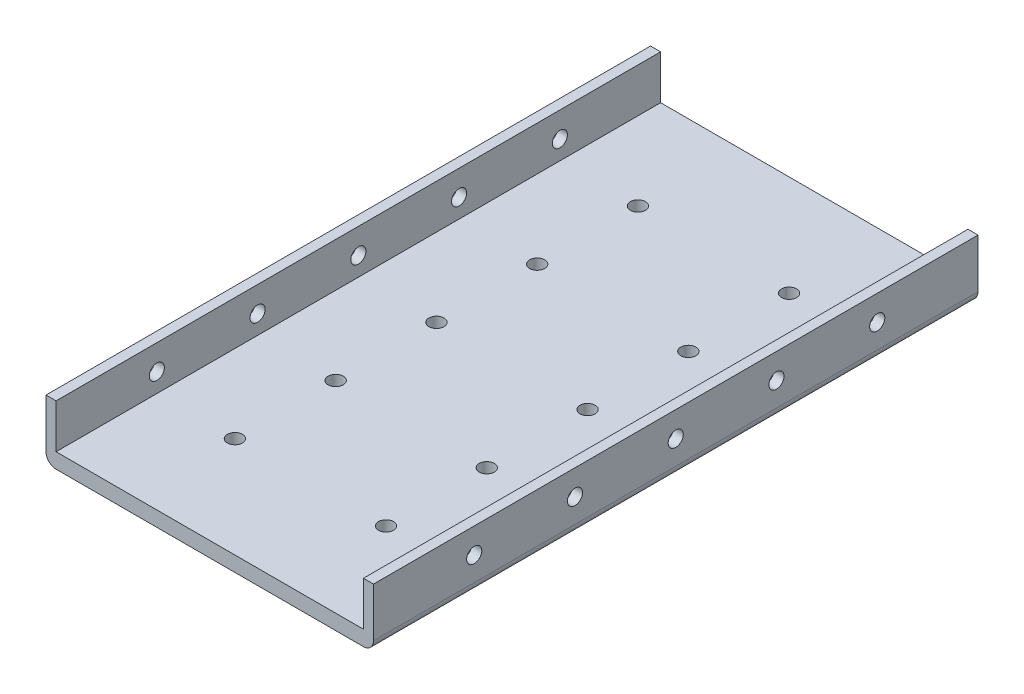
ISO-10303-21;
HEADER;
FILE_DESCRIPTION(('STEP AP214'),'2;1');
FILE_NAME('part.step','',(''),(''),'','','');
FILE_SCHEMA(('AUTOMOTIVE_DESIGN { 1 0 10303 214 1 1 1 1 }'));
ENDSEC;
DATA;
#1=APPLICATION_CONTEXT('core data for automotive mechanical design processes');
#2=APPLICATION_PROTOCOL_DEFINITION('international standard','automotive_design',2000,#1);
#3=PRODUCT_CONTEXT('',#1,'mechanical');
#4=PRODUCT('Part','Part','',(#3));
#5=PRODUCT_RELATED_PRODUCT_CATEGORY('part','',(#4));
#6=PRODUCT_DEFINITION_FORMATION('','',#4);
#7=PRODUCT_DEFINITION_CONTEXT('part definition',#1,'design');
#8=PRODUCT_DEFINITION('design','',#6,#7);
#9=PRODUCT_DEFINITION_SHAPE('','',#8);
#10=(LENGTH_UNIT() NAMED_UNIT(*) SI_UNIT(.MILLI.,.METRE.));
#11=(NAMED_UNIT(*) PLANE_ANGLE_UNIT() SI_UNIT($,.RADIAN.));
#12=(NAMED_UNIT(*) SI_UNIT($,.STERADIAN.) SOLID_ANGLE_UNIT());
#13=UNCERTAINTY_MEASURE_WITH_UNIT(LENGTH_MEASURE(1.E-05),#10,'distance_accuracy_value','');
#14=(GEOMETRIC_REPRESENTATION_CONTEXT(3) GLOBAL_UNCERTAINTY_ASSIGNED_CONTEXT((#13)) GLOBAL_UNIT_ASSIGNED_CONTEXT((#10,
#11,#12)) REPRESENTATION_CONTEXT('',''));
#15=CARTESIAN_POINT('',(0.,0.,0.));
#16=DIRECTION('',(0.,0.,1.));
#17=DIRECTION('',(1.,0.,0.));
#18=AXIS2_PLACEMENT_3D('',#15,#16,#17);
#19=CARTESIAN_POINT('',(0.,3.,0.));
#20=DIRECTION('',(0.,-1.,0.));
#21=DIRECTION('',(0.,0.,-1.));
#22=AXIS2_PLACEMENT_3D('',#19,#20,#21);
#23=PLANE('',#22);
#24=CARTESIAN_POINT('',(15.,3.,0.));
#25=DIRECTION('',(0.,-1.,0.));
#26=DIRECTION('',(0.,0.,-1.));
#27=AXIS2_PLACEMENT_3D('',#24,#25,#26);
#28=CIRCLE('',#27,1.5);
#29=CARTESIAN_POINT('',(15.,3.,-1.50000000000001));
#30=VERTEX_POINT('',#29);
#31=EDGE_CURVE('E286',#30,#30,#28,.T.);
#32=ORIENTED_EDGE('',*,*,#31,.T.);
#33=EDGE_LOOP('',(#32));
#34=FACE_BOUND('',#33,.T.);
#35=CARTESIAN_POINT('',(-15.,3.,-20.));
#36=DIRECTION('',(0.,-1.,0.));
#37=DIRECTION('',(0.,0.,-1.));
#38=AXIS2_PLACEMENT_3D('',#35,#36,#37);
#39=CIRCLE('',#38,1.5);
#40=CARTESIAN_POINT('',(-15.,3.,-21.5));
#41=VERTEX_POINT('',#40);
#42=EDGE_CURVE('E283',#41,#41,#39,.T.);
#43=ORIENTED_EDGE('',*,*,#42,.T.);
#44=EDGE_LOOP('',(#43));
#45=FACE_BOUND('',#44,.T.);
#46=CARTESIAN_POINT('',(15.,3.,-20.));
#47=DIRECTION('',(0.,-1.,0.));
#48=DIRECTION('',(0.,0.,-1.));
#49=AXIS2_PLACEMENT_3D('',#46,#47,#48);
#50=CIRCLE('',#49,1.49999999999999);
#51=CARTESIAN_POINT('',(15.,3.,-21.5));
#52=VERTEX_POINT('',#51);
#53=EDGE_CURVE('E280',#52,#52,#50,.T.);
#54=ORIENTED_EDGE('',*,*,#53,.T.);
#55=EDGE_LOOP('',(#54));
#56=FACE_BOUND('',#55,.T.);
#57=CARTESIAN_POINT('',(-15.,3.,-40.));
#58=DIRECTION('',(0.,-1.,0.));
#59=DIRECTION('',(0.,0.,-1.));
#60=AXIS2_PLACEMENT_3D('',#57,#58,#59);
#61=CIRCLE('',#60,1.5);
#62=CARTESIAN_POINT('',(-15.,3.,-41.5));
#63=VERTEX_POINT('',#62);
#64=EDGE_CURVE('E277',#63,#63,#61,.T.);
#65=ORIENTED_EDGE('',*,*,#64,.T.);
#66=EDGE_LOOP('',(#65));
#67=FACE_BOUND('',#66,.T.);
#68=CARTESIAN_POINT('',(15.,3.,40.));
#69=DIRECTION('',(0.,-1.,0.));
#70=DIRECTION('',(0.,0.,-1.));
#71=AXIS2_PLACEMENT_3D('',#68,#69,#70);
#72=CIRCLE('',#71,1.5);
#73=CARTESIAN_POINT('',(15.,3.,38.5));
#74=VERTEX_POINT('',#73);
#75=EDGE_CURVE('E274',#74,#74,#72,.T.);
#76=ORIENTED_EDGE('',*,*,#75,.T.);
#77=EDGE_LOOP('',(#76));
#78=FACE_BOUND('',#77,.T.);
#79=CARTESIAN_POINT('',(-15.,3.,20.));
#80=DIRECTION('',(0.,-1.,0.));
#81=DIRECTION('',(0.,0.,-1.));
#82=AXIS2_PLACEMENT_3D('',#79,#80,#81);
#83=CIRCLE('',#82,1.5);
#84=CARTESIAN_POINT('',(-15.,3.,18.5));
#85=VERTEX_POINT('',#84);
#86=EDGE_CURVE('E271',#85,#85,#83,.T.);
#87=ORIENTED_EDGE('',*,*,#86,.T.);
#88=EDGE_LOOP('',(#87));
#89=FACE_BOUND('',#88,.T.);
#90=CARTESIAN_POINT('',(15.,3.,20.));
#91=DIRECTION('',(0.,-1.,0.));
#92=DIRECTION('',(0.,0.,-1.));
#93=AXIS2_PLACEMENT_3D('',#90,#91,#92);
#94=CIRCLE('',#93,1.49999999999999);
#95=CARTESIAN_POINT('',(15.,3.,18.5));
#96=VERTEX_POINT('',#95);
#97=EDGE_CURVE('E268',#96,#96,#94,.T.);
#98=ORIENTED_EDGE('',*,*,#97,.T.);
#99=EDGE_LOOP('',(#98));
#100=FACE_BOUND('',#99,.T.);
#101=CARTESIAN_POINT('',(-15.,3.,0.));
#102=DIRECTION('',(0.,-1.,0.));
#103=DIRECTION('',(0.,0.,-1.));
#104=AXIS2_PLACEMENT_3D('',#101,#102,#103);
#105=CIRCLE('',#104,1.5);
#106=CARTESIAN_POINT('',(-15.,3.,-1.50000000000002));
#107=VERTEX_POINT('',#106);
#108=EDGE_CURVE('E265',#107,#107,#105,.T.);
#109=ORIENTED_EDGE('',*,*,#108,.T.);
#110=EDGE_LOOP('',(#109));
#111=FACE_BOUND('',#110,.T.);
#112=CARTESIAN_POINT('',(15.,3.,-40.));
#113=DIRECTION('',(0.,-1.,0.));
#114=DIRECTION('',(0.,0.,-1.));
#115=AXIS2_PLACEMENT_3D('',#112,#113,#114);
#116=CIRCLE('',#115,1.5);
#117=CARTESIAN_POINT('',(15.,3.,-41.5));
#118=VERTEX_POINT('',#117);
#119=EDGE_CURVE('E262',#118,#118,#116,.T.);
#120=ORIENTED_EDGE('',*,*,#119,.T.);
#121=EDGE_LOOP('',(#120));
#122=FACE_BOUND('',#121,.T.);
#123=CARTESIAN_POINT('',(-15.,3.,40.));
#124=DIRECTION('',(0.,-1.,0.));
#125=DIRECTION('',(0.,0.,-1.));
#126=AXIS2_PLACEMENT_3D('',#123,#124,#125);
#127=CIRCLE('',#126,1.5);
#128=CARTESIAN_POINT('',(-15.,3.,38.5));
#129=VERTEX_POINT('',#128);
#130=EDGE_CURVE('E259',#129,#129,#127,.T.);
#131=ORIENTED_EDGE('',*,*,#130,.T.);
#132=EDGE_LOOP('',(#131));
#133=FACE_BOUND('',#132,.T.);
#134=DIRECTION('',(0.,0.,1.));
#135=VECTOR('',#134,1.);
#136=CARTESIAN_POINT('',(30.5,3.,-60.));
#137=LINE('',#136,#135);
#138=CARTESIAN_POINT('',(30.5,3.,-60.));
#139=VERTEX_POINT('',#138);
#140=CARTESIAN_POINT('',(30.5,3.,60.));
#141=VERTEX_POINT('',#140);
#142=EDGE_CURVE('E148',#139,#141,#137,.T.);
#143=ORIENTED_EDGE('',*,*,#142,.F.);
#144=DIRECTION('',(-1.,0.,0.));
#145=VECTOR('',#144,1.);
#146=CARTESIAN_POINT('',(-32.5,3.,-60.));
#147=LINE('',#146,#145);
#148=CARTESIAN_POINT('',(-30.5,3.,-60.));
#149=VERTEX_POINT('',#148);
#150=EDGE_CURVE('E176',#139,#149,#147,.T.);
#151=ORIENTED_EDGE('',*,*,#150,.T.);
#152=DIRECTION('',(0.,0.,-1.));
#153=VECTOR('',#152,1.);
#154=CARTESIAN_POINT('',(-30.5,3.,-60.));
#155=LINE('',#154,#153);
#156=CARTESIAN_POINT('',(-30.5,3.,60.));
#157=VERTEX_POINT('',#156);
#158=EDGE_CURVE('E152',#157,#149,#155,.T.);
#159=ORIENTED_EDGE('',*,*,#158,.F.);
#160=DIRECTION('',(1.,0.,0.));
#161=VECTOR('',#160,1.);
#162=CARTESIAN_POINT('',(-32.5,3.,60.));
#163=LINE('',#162,#161);
#164=EDGE_CURVE('E133',#157,#141,#163,.T.);
#165=ORIENTED_EDGE('',*,*,#164,.T.);
#166=EDGE_LOOP('',(#143,#151,#159,#165));
#167=FACE_BOUND('',#166,.T.);
#168=ADVANCED_FACE('F41',(#34,#45,#56,#67,#78,#89,#100,#111,#122,#133,#167),#23,.F.);
#169=CARTESIAN_POINT('',(32.5,3.,60.));
#170=DIRECTION('',(-1.,0.,0.));
#171=DIRECTION('',(0.,0.,1.));
#172=AXIS2_PLACEMENT_3D('',#169,#170,#171);
#173=PLANE('',#172);
#174=CARTESIAN_POINT('',(32.5,6.75,-40.));
#175=DIRECTION('',(-1.,0.,0.));
#176=DIRECTION('',(0.,0.,1.));
#177=AXIS2_PLACEMENT_3D('',#174,#175,#176);
#178=CIRCLE('',#177,1.5);
#179=CARTESIAN_POINT('',(32.5,6.75,-38.5));
#180=VERTEX_POINT('',#179);
#181=EDGE_CURVE('E204',#180,#180,#178,.T.);
#182=ORIENTED_EDGE('',*,*,#181,.T.);
#183=EDGE_LOOP('',(#182));
#184=FACE_BOUND('',#183,.T.);
#185=CARTESIAN_POINT('',(32.5,6.75,-20.));
#186=DIRECTION('',(-1.,0.,0.));
#187=DIRECTION('',(0.,0.,1.));
#188=AXIS2_PLACEMENT_3D('',#185,#186,#187);
#189=CIRCLE('',#188,1.5);
#190=CARTESIAN_POINT('',(32.5,6.75,-18.5));
#191=VERTEX_POINT('',#190);
#192=EDGE_CURVE('E672',#191,#191,#189,.T.);
#193=ORIENTED_EDGE('',*,*,#192,.T.);
#194=EDGE_LOOP('',(#193));
#195=FACE_BOUND('',#194,.T.);
#196=CARTESIAN_POINT('',(32.5,6.75,0.));
#197=DIRECTION('',(-1.,0.,0.));
#198=DIRECTION('',(0.,0.,1.));
#199=AXIS2_PLACEMENT_3D('',#196,#197,#198);
#200=CIRCLE('',#199,1.5);
#201=CARTESIAN_POINT('',(32.5,6.75,1.5));
#202=VERTEX_POINT('',#201);
#203=EDGE_CURVE('E666',#202,#202,#200,.T.);
#204=ORIENTED_EDGE('',*,*,#203,.T.);
#205=EDGE_LOOP('',(#204));
#206=FACE_BOUND('',#205,.T.);
#207=CARTESIAN_POINT('',(32.5,6.75,20.));
#208=DIRECTION('',(-1.,0.,0.));
#209=DIRECTION('',(0.,0.,1.));
#210=AXIS2_PLACEMENT_3D('',#207,#208,#209);
#211=CIRCLE('',#210,1.5);
#212=CARTESIAN_POINT('',(32.5,6.75,21.5));
#213=VERTEX_POINT('',#212);
#214=EDGE_CURVE('E660',#213,#213,#211,.T.);
#215=ORIENTED_EDGE('',*,*,#214,.T.);
#216=EDGE_LOOP('',(#215));
#217=FACE_BOUND('',#216,.T.);
#218=CARTESIAN_POINT('',(32.5,6.75,40.));
#219=DIRECTION('',(-1.,0.,0.));
#220=DIRECTION('',(0.,0.,1.));
#221=AXIS2_PLACEMENT_3D('',#218,#219,#220);
#222=CIRCLE('',#221,1.5);
#223=CARTESIAN_POINT('',(32.5,6.75,41.5));
#224=VERTEX_POINT('',#223);
#225=EDGE_CURVE('E654',#224,#224,#222,.T.);
#226=ORIENTED_EDGE('',*,*,#225,.T.);
#227=EDGE_LOOP('',(#226));
#228=FACE_BOUND('',#227,.T.);
#229=DIRECTION('',(0.,-1.,0.));
#230=VECTOR('',#229,1.);
#231=CARTESIAN_POINT('',(32.5,3.,60.));
#232=LINE('',#231,#230);
#233=CARTESIAN_POINT('',(32.5,11.75,60.));
#234=VERTEX_POINT('',#233);
#235=CARTESIAN_POINT('',(32.5,2.,60.));
#236=VERTEX_POINT('',#235);
#237=EDGE_CURVE('E122',#234,#236,#232,.T.);
#238=ORIENTED_EDGE('',*,*,#237,.T.);
#239=DIRECTION('',(0.,0.,-1.));
#240=VECTOR('',#239,1.);
#241=CARTESIAN_POINT('',(32.5,2.,-60.));
#242=LINE('',#241,#240);
#243=CARTESIAN_POINT('',(32.5,2.,-60.));
#244=VERTEX_POINT('',#243);
#245=EDGE_CURVE('E189',#236,#244,#242,.T.);
#246=ORIENTED_EDGE('',*,*,#245,.T.);
#247=DIRECTION('',(0.,-1.,0.));
#248=VECTOR('',#247,1.);
#249=CARTESIAN_POINT('',(32.5,3.,-60.));
#250=LINE('',#249,#248);
#251=CARTESIAN_POINT('',(32.5,11.75,-60.));
#252=VERTEX_POINT('',#251);
#253=EDGE_CURVE('E146',#252,#244,#250,.T.);
#254=ORIENTED_EDGE('',*,*,#253,.F.);
#255=DIRECTION('',(0.,0.,-1.));
#256=VECTOR('',#255,1.);
#257=CARTESIAN_POINT('',(32.5,11.75,-60.));
#258=LINE('',#257,#256);
#259=EDGE_CURVE('E138',#234,#252,#258,.T.);
#260=ORIENTED_EDGE('',*,*,#259,.F.);
#261=EDGE_LOOP('',(#238,#246,#254,#260));
#262=FACE_BOUND('',#261,.T.);
#263=ADVANCED_FACE('F144',(#184,#195,#206,#217,#228,#262),#173,.F.);
#264=CARTESIAN_POINT('',(-32.5,3.,-60.));
#265=DIRECTION('',(0.,0.,1.));
#266=DIRECTION('',(1.,0.,0.));
#267=AXIS2_PLACEMENT_3D('',#264,#265,#266);
#268=PLANE('',#267);
#269=ORIENTED_EDGE('',*,*,#253,.T.);
#270=CARTESIAN_POINT('',(30.5,2.,-60.));
#271=DIRECTION('',(0.,0.,1.));
#272=DIRECTION('',(1.,0.,0.));
#273=AXIS2_PLACEMENT_3D('',#270,#271,#272);
#274=CIRCLE('',#273,2.);
#275=CARTESIAN_POINT('',(30.5,0.,-60.));
#276=VERTEX_POINT('',#275);
#277=EDGE_CURVE('E193',#244,#276,#274,.F.);
#278=ORIENTED_EDGE('',*,*,#277,.T.);
#279=DIRECTION('',(-1.,0.,0.));
#280=VECTOR('',#279,1.);
#281=CARTESIAN_POINT('',(-32.5,0.,-60.));
#282=LINE('',#281,#280);
#283=CARTESIAN_POINT('',(-30.5,0.,-60.));
#284=VERTEX_POINT('',#283);
#285=EDGE_CURVE('E175',#276,#284,#282,.T.);
#286=ORIENTED_EDGE('',*,*,#285,.T.);
#287=CARTESIAN_POINT('',(-30.5,2.,-60.));
#288=DIRECTION('',(0.,0.,1.));
#289=DIRECTION('',(1.,0.,0.));
#290=AXIS2_PLACEMENT_3D('',#287,#288,#289);
#291=CIRCLE('',#290,2.);
#292=CARTESIAN_POINT('',(-32.5,2.,-60.));
#293=VERTEX_POINT('',#292);
#294=EDGE_CURVE('E191',#284,#293,#291,.F.);
#295=ORIENTED_EDGE('',*,*,#294,.T.);
#296=DIRECTION('',(0.,-1.,0.));
#297=VECTOR('',#296,1.);
#298=CARTESIAN_POINT('',(-32.5,3.,-60.));
#299=LINE('',#298,#297);
#300=CARTESIAN_POINT('',(-32.5,11.75,-60.));
#301=VERTEX_POINT('',#300);
#302=EDGE_CURVE('E185',#301,#293,#299,.T.);
#303=ORIENTED_EDGE('',*,*,#302,.F.);
#304=DIRECTION('',(-1.,0.,0.));
#305=VECTOR('',#304,1.);
#306=CARTESIAN_POINT('',(-32.5,11.75,-60.));
#307=LINE('',#306,#305);
#308=CARTESIAN_POINT('',(-30.5,11.75,-60.));
#309=VERTEX_POINT('',#308);
#310=EDGE_CURVE('E164',#309,#301,#307,.T.);
#311=ORIENTED_EDGE('',*,*,#310,.F.);
#312=DIRECTION('',(0.,-1.,0.));
#313=VECTOR('',#312,1.);
#314=CARTESIAN_POINT('',(-30.5,11.75,-60.));
#315=LINE('',#314,#313);
#316=EDGE_CURVE('E167',#309,#149,#315,.T.);
#317=ORIENTED_EDGE('',*,*,#316,.T.);
#318=ORIENTED_EDGE('',*,*,#150,.F.);
#319=DIRECTION('',(0.,-1.,0.));
#320=VECTOR('',#319,1.);
#321=CARTESIAN_POINT('',(30.5,11.75,-60.));
#322=LINE('',#321,#320);
#323=CARTESIAN_POINT('',(30.5,11.75,-60.));
#324=VERTEX_POINT('',#323);
#325=EDGE_CURVE('E289',#324,#139,#322,.T.);
#326=ORIENTED_EDGE('',*,*,#325,.F.);
#327=DIRECTION('',(-1.,0.,0.));
#328=VECTOR('',#327,1.);
#329=CARTESIAN_POINT('',(32.5,11.75,-60.));
#330=LINE('',#329,#328);
#331=EDGE_CURVE('E149',#252,#324,#330,.T.);
#332=ORIENTED_EDGE('',*,*,#331,.F.);
#333=EDGE_LOOP('',(#269,#278,#286,#295,#303,#311,#317,#318,#326,#332));
#334=FACE_BOUND('',#333,.T.);
#335=ADVANCED_FACE('F300',(#334),#268,.F.);
#336=CARTESIAN_POINT('',(-32.5,3.,60.));
#337=DIRECTION('',(1.,0.,0.));
#338=DIRECTION('',(0.,0.,-1.));
#339=AXIS2_PLACEMENT_3D('',#336,#337,#338);
#340=PLANE('',#339);
#341=CARTESIAN_POINT('',(-32.5,6.75,-40.));
#342=DIRECTION('',(-1.,0.,0.));
#343=DIRECTION('',(0.,0.,1.));
#344=AXIS2_PLACEMENT_3D('',#341,#342,#343);
#345=CIRCLE('',#344,1.5);
#346=CARTESIAN_POINT('',(-32.5,6.75,-38.5));
#347=VERTEX_POINT('',#346);
#348=EDGE_CURVE('E642',#347,#347,#345,.T.);
#349=ORIENTED_EDGE('',*,*,#348,.F.);
#350=EDGE_LOOP('',(#349));
#351=FACE_BOUND('',#350,.T.);
#352=CARTESIAN_POINT('',(-32.5,6.75,-20.));
#353=DIRECTION('',(-1.,0.,0.));
#354=DIRECTION('',(0.,0.,1.));
#355=AXIS2_PLACEMENT_3D('',#352,#353,#354);
#356=CIRCLE('',#355,1.5);
#357=CARTESIAN_POINT('',(-32.5,6.75,-18.5));
#358=VERTEX_POINT('',#357);
#359=EDGE_CURVE('E675',#358,#358,#356,.T.);
#360=ORIENTED_EDGE('',*,*,#359,.F.);
#361=EDGE_LOOP('',(#360));
#362=FACE_BOUND('',#361,.T.);
#363=CARTESIAN_POINT('',(-32.5,6.75,0.));
#364=DIRECTION('',(-1.,0.,0.));
#365=DIRECTION('',(0.,0.,1.));
#366=AXIS2_PLACEMENT_3D('',#363,#364,#365);
#367=CIRCLE('',#366,1.5);
#368=CARTESIAN_POINT('',(-32.5,6.75,1.5));
#369=VERTEX_POINT('',#368);
#370=EDGE_CURVE('E669',#369,#369,#367,.T.);
#371=ORIENTED_EDGE('',*,*,#370,.F.);
#372=EDGE_LOOP('',(#371));
#373=FACE_BOUND('',#372,.T.);
#374=CARTESIAN_POINT('',(-32.5,6.75,20.));
#375=DIRECTION('',(-1.,0.,0.));
#376=DIRECTION('',(0.,0.,1.));
#377=AXIS2_PLACEMENT_3D('',#374,#375,#376);
#378=CIRCLE('',#377,1.5);
#379=CARTESIAN_POINT('',(-32.5,6.75,21.5));
#380=VERTEX_POINT('',#379);
#381=EDGE_CURVE('E663',#380,#380,#378,.T.);
#382=ORIENTED_EDGE('',*,*,#381,.F.);
#383=EDGE_LOOP('',(#382));
#384=FACE_BOUND('',#383,.T.);
#385=CARTESIAN_POINT('',(-32.5,6.75,40.));
#386=DIRECTION('',(-1.,0.,0.));
#387=DIRECTION('',(0.,0.,1.));
#388=AXIS2_PLACEMENT_3D('',#385,#386,#387);
#389=CIRCLE('',#388,1.5);
#390=CARTESIAN_POINT('',(-32.5,6.75,41.5));
#391=VERTEX_POINT('',#390);
#392=EDGE_CURVE('E657',#391,#391,#389,.T.);
#393=ORIENTED_EDGE('',*,*,#392,.F.);
#394=EDGE_LOOP('',(#393));
#395=FACE_BOUND('',#394,.T.);
#396=ORIENTED_EDGE('',*,*,#302,.T.);
#397=DIRECTION('',(0.,0.,1.));
#398=VECTOR('',#397,1.);
#399=CARTESIAN_POINT('',(-32.5,2.,60.));
#400=LINE('',#399,#398);
#401=CARTESIAN_POINT('',(-32.5,2.,60.));
#402=VERTEX_POINT('',#401);
#403=EDGE_CURVE('E11',#293,#402,#400,.T.);
#404=ORIENTED_EDGE('',*,*,#403,.T.);
#405=DIRECTION('',(0.,-1.,0.));
#406=VECTOR('',#405,1.);
#407=CARTESIAN_POINT('',(-32.5,3.,60.));
#408=LINE('',#407,#406);
#409=CARTESIAN_POINT('',(-32.5,11.75,60.));
#410=VERTEX_POINT('',#409);
#411=EDGE_CURVE('E132',#410,#402,#408,.T.);
#412=ORIENTED_EDGE('',*,*,#411,.F.);
#413=DIRECTION('',(0.,0.,1.));
#414=VECTOR('',#413,1.);
#415=CARTESIAN_POINT('',(-32.5,11.75,-60.));
#416=LINE('',#415,#414);
#417=EDGE_CURVE('E157',#301,#410,#416,.T.);
#418=ORIENTED_EDGE('',*,*,#417,.F.);
#419=EDGE_LOOP('',(#396,#404,#412,#418));
#420=FACE_BOUND('',#419,.T.);
#421=ADVANCED_FACE('F311',(#351,#362,#373,#384,#395,#420),#340,.F.);
#422=CARTESIAN_POINT('',(-32.5,3.,60.));
#423=DIRECTION('',(0.,0.,-1.));
#424=DIRECTION('',(-1.,0.,0.));
#425=AXIS2_PLACEMENT_3D('',#422,#423,#424);
#426=PLANE('',#425);
#427=DIRECTION('',(1.,0.,0.));
#428=VECTOR('',#427,1.);
#429=CARTESIAN_POINT('',(-32.5,0.,60.));
#430=LINE('',#429,#428);
#431=CARTESIAN_POINT('',(-30.5,0.,60.));
#432=VERTEX_POINT('',#431);
#433=CARTESIAN_POINT('',(30.5,0.,60.));
#434=VERTEX_POINT('',#433);
#435=EDGE_CURVE('E178',#432,#434,#430,.T.);
#436=ORIENTED_EDGE('',*,*,#435,.T.);
#437=CARTESIAN_POINT('',(30.5,2.,60.));
#438=DIRECTION('',(0.,0.,-1.));
#439=DIRECTION('',(-1.,0.,0.));
#440=AXIS2_PLACEMENT_3D('',#437,#438,#439);
#441=CIRCLE('',#440,2.);
#442=EDGE_CURVE('E50',#434,#236,#441,.F.);
#443=ORIENTED_EDGE('',*,*,#442,.T.);
#444=ORIENTED_EDGE('',*,*,#237,.F.);
#445=DIRECTION('',(1.,0.,0.));
#446=VECTOR('',#445,1.);
#447=CARTESIAN_POINT('',(32.5,11.75,60.));
#448=LINE('',#447,#446);
#449=CARTESIAN_POINT('',(30.5,11.75,60.));
#450=VERTEX_POINT('',#449);
#451=EDGE_CURVE('E126',#450,#234,#448,.T.);
#452=ORIENTED_EDGE('',*,*,#451,.F.);
#453=DIRECTION('',(0.,-1.,0.));
#454=VECTOR('',#453,1.);
#455=CARTESIAN_POINT('',(30.5,11.75,60.));
#456=LINE('',#455,#454);
#457=EDGE_CURVE('E142',#450,#141,#456,.T.);
#458=ORIENTED_EDGE('',*,*,#457,.T.);
#459=ORIENTED_EDGE('',*,*,#164,.F.);
#460=DIRECTION('',(0.,-1.,0.));
#461=VECTOR('',#460,1.);
#462=CARTESIAN_POINT('',(-30.5,11.75,60.));
#463=LINE('',#462,#461);
#464=CARTESIAN_POINT('',(-30.5,11.75,60.));
#465=VERTEX_POINT('',#464);
#466=EDGE_CURVE('E172',#465,#157,#463,.T.);
#467=ORIENTED_EDGE('',*,*,#466,.F.);
#468=DIRECTION('',(1.,0.,0.));
#469=VECTOR('',#468,1.);
#470=CARTESIAN_POINT('',(-32.5,11.75,60.));
#471=LINE('',#470,#469);
#472=EDGE_CURVE('E160',#410,#465,#471,.T.);
#473=ORIENTED_EDGE('',*,*,#472,.F.);
#474=ORIENTED_EDGE('',*,*,#411,.T.);
#475=CARTESIAN_POINT('',(-30.5,2.,60.));
#476=DIRECTION('',(0.,0.,-1.));
#477=DIRECTION('',(-1.,0.,0.));
#478=AXIS2_PLACEMENT_3D('',#475,#476,#477);
#479=CIRCLE('',#478,2.);
#480=EDGE_CURVE('E58',#402,#432,#479,.F.);
#481=ORIENTED_EDGE('',*,*,#480,.T.);
#482=EDGE_LOOP('',(#436,#443,#444,#452,#458,#459,#467,#473,#474,#481));
#483=FACE_BOUND('',#482,.T.);
#484=ADVANCED_FACE('F124',(#483),#426,.F.);
#485=CARTESIAN_POINT('',(0.,0.,0.));
#486=DIRECTION('',(0.,-1.,0.));
#487=DIRECTION('',(0.,0.,-1.));
#488=AXIS2_PLACEMENT_3D('',#485,#486,#487);
#489=PLANE('',#488);
#490=CARTESIAN_POINT('',(15.,0.,0.));
#491=DIRECTION('',(0.,-1.,0.));
#492=DIRECTION('',(0.,0.,1.));
#493=AXIS2_PLACEMENT_3D('',#490,#491,#492);
#494=CIRCLE('',#493,1.5);
#495=CARTESIAN_POINT('',(15.,0.,1.49999999999998));
#496=VERTEX_POINT('',#495);
#497=EDGE_CURVE('E239',#496,#496,#494,.T.);
#498=ORIENTED_EDGE('',*,*,#497,.F.);
#499=EDGE_LOOP('',(#498));
#500=FACE_BOUND('',#499,.T.);
#501=CARTESIAN_POINT('',(-15.,0.,-20.));
#502=DIRECTION('',(0.,-1.,0.));
#503=DIRECTION('',(0.,0.,-1.));
#504=AXIS2_PLACEMENT_3D('',#501,#502,#503);
#505=CIRCLE('',#504,1.5);
#506=CARTESIAN_POINT('',(-15.,0.,-21.5));
#507=VERTEX_POINT('',#506);
#508=EDGE_CURVE('E236',#507,#507,#505,.T.);
#509=ORIENTED_EDGE('',*,*,#508,.F.);
#510=EDGE_LOOP('',(#509));
#511=FACE_BOUND('',#510,.T.);
#512=CARTESIAN_POINT('',(15.,0.,-20.));
#513=DIRECTION('',(0.,-1.,0.));
#514=DIRECTION('',(0.,0.,1.));
#515=AXIS2_PLACEMENT_3D('',#512,#513,#514);
#516=CIRCLE('',#515,1.49999999999999);
#517=CARTESIAN_POINT('',(15.,0.,-18.5));
#518=VERTEX_POINT('',#517);
#519=EDGE_CURVE('E233',#518,#518,#516,.T.);
#520=ORIENTED_EDGE('',*,*,#519,.F.);
#521=EDGE_LOOP('',(#520));
#522=FACE_BOUND('',#521,.T.);
#523=CARTESIAN_POINT('',(-15.,0.,-40.));
#524=DIRECTION('',(0.,-1.,0.));
#525=DIRECTION('',(0.,0.,-1.));
#526=AXIS2_PLACEMENT_3D('',#523,#524,#525);
#527=CIRCLE('',#526,1.5);
#528=CARTESIAN_POINT('',(-15.,0.,-41.5));
#529=VERTEX_POINT('',#528);
#530=EDGE_CURVE('E232',#529,#529,#527,.T.);
#531=ORIENTED_EDGE('',*,*,#530,.F.);
#532=EDGE_LOOP('',(#531));
#533=FACE_BOUND('',#532,.T.);
#534=CARTESIAN_POINT('',(15.,0.,40.));
#535=DIRECTION('',(0.,-1.,0.));
#536=DIRECTION('',(0.,0.,1.));
#537=AXIS2_PLACEMENT_3D('',#534,#535,#536);
#538=CIRCLE('',#537,1.5);
#539=CARTESIAN_POINT('',(15.,0.,41.5));
#540=VERTEX_POINT('',#539);
#541=EDGE_CURVE('E251',#540,#540,#538,.T.);
#542=ORIENTED_EDGE('',*,*,#541,.F.);
#543=EDGE_LOOP('',(#542));
#544=FACE_BOUND('',#543,.T.);
#545=CARTESIAN_POINT('',(-15.,0.,20.));
#546=DIRECTION('',(0.,-1.,0.));
#547=DIRECTION('',(0.,0.,-1.));
#548=AXIS2_PLACEMENT_3D('',#545,#546,#547);
#549=CIRCLE('',#548,1.5);
#550=CARTESIAN_POINT('',(-15.,0.,18.5));
#551=VERTEX_POINT('',#550);
#552=EDGE_CURVE('E248',#551,#551,#549,.T.);
#553=ORIENTED_EDGE('',*,*,#552,.F.);
#554=EDGE_LOOP('',(#553));
#555=FACE_BOUND('',#554,.T.);
#556=CARTESIAN_POINT('',(15.,0.,20.));
#557=DIRECTION('',(0.,-1.,0.));
#558=DIRECTION('',(0.,0.,1.));
#559=AXIS2_PLACEMENT_3D('',#556,#557,#558);
#560=CIRCLE('',#559,1.49999999999999);
#561=CARTESIAN_POINT('',(15.,0.,21.5));
#562=VERTEX_POINT('',#561);
#563=EDGE_CURVE('E245',#562,#562,#560,.T.);
#564=ORIENTED_EDGE('',*,*,#563,.F.);
#565=EDGE_LOOP('',(#564));
#566=FACE_BOUND('',#565,.T.);
#567=CARTESIAN_POINT('',(-15.,0.,0.));
#568=DIRECTION('',(0.,-1.,0.));
#569=DIRECTION('',(0.,0.,-1.));
#570=AXIS2_PLACEMENT_3D('',#567,#568,#569);
#571=CIRCLE('',#570,1.5);
#572=CARTESIAN_POINT('',(-15.,0.,-1.50000000000002));
#573=VERTEX_POINT('',#572);
#574=EDGE_CURVE('E242',#573,#573,#571,.T.);
#575=ORIENTED_EDGE('',*,*,#574,.F.);
#576=EDGE_LOOP('',(#575));
#577=FACE_BOUND('',#576,.T.);
#578=CARTESIAN_POINT('',(15.,0.,-40.));
#579=DIRECTION('',(0.,-1.,0.));
#580=DIRECTION('',(0.,0.,1.));
#581=AXIS2_PLACEMENT_3D('',#578,#579,#580);
#582=CIRCLE('',#581,1.5);
#583=CARTESIAN_POINT('',(15.,0.,-38.5));
#584=VERTEX_POINT('',#583);
#585=EDGE_CURVE('E229',#584,#584,#582,.T.);
#586=ORIENTED_EDGE('',*,*,#585,.F.);
#587=EDGE_LOOP('',(#586));
#588=FACE_BOUND('',#587,.T.);
#589=CARTESIAN_POINT('',(-15.,0.,40.));
#590=DIRECTION('',(0.,-1.,0.));
#591=DIRECTION('',(0.,0.,-1.));
#592=AXIS2_PLACEMENT_3D('',#589,#590,#591);
#593=CIRCLE('',#592,1.5);
#594=CARTESIAN_POINT('',(-15.,0.,38.5));
#595=VERTEX_POINT('',#594);
#596=EDGE_CURVE('E254',#595,#595,#593,.T.);
#597=ORIENTED_EDGE('',*,*,#596,.F.);
#598=EDGE_LOOP('',(#597));
#599=FACE_BOUND('',#598,.T.);
#600=ORIENTED_EDGE('',*,*,#285,.F.);
#601=DIRECTION('',(0.,0.,-1.));
#602=VECTOR('',#601,1.);
#603=CARTESIAN_POINT('',(30.5,0.,60.));
#604=LINE('',#603,#602);
#605=EDGE_CURVE('E65',#276,#434,#604,.F.);
#606=ORIENTED_EDGE('',*,*,#605,.T.);
#607=ORIENTED_EDGE('',*,*,#435,.F.);
#608=DIRECTION('',(0.,0.,1.));
#609=VECTOR('',#608,1.);
#610=CARTESIAN_POINT('',(-30.5,0.,-60.));
#611=LINE('',#610,#609);
#612=EDGE_CURVE('E195',#432,#284,#611,.F.);
#613=ORIENTED_EDGE('',*,*,#612,.T.);
#614=EDGE_LOOP('',(#600,#606,#607,#613));
#615=FACE_BOUND('',#614,.T.);
#616=ADVANCED_FACE('F313',(#500,#511,#522,#533,#544,#555,#566,#577,#588,#599,#615),#489,.T.);
#617=CARTESIAN_POINT('',(-30.5,11.75,-60.));
#618=DIRECTION('',(-1.,0.,0.));
#619=DIRECTION('',(0.,0.,1.));
#620=AXIS2_PLACEMENT_3D('',#617,#618,#619);
#621=PLANE('',#620);
#622=CARTESIAN_POINT('',(-30.5,6.75,-40.));
#623=DIRECTION('',(-1.,0.,0.));
#624=DIRECTION('',(0.,0.,1.));
#625=AXIS2_PLACEMENT_3D('',#622,#623,#624);
#626=CIRCLE('',#625,1.5);
#627=CARTESIAN_POINT('',(-30.5,6.75,-38.5));
#628=VERTEX_POINT('',#627);
#629=EDGE_CURVE('E226',#628,#628,#626,.T.);
#630=ORIENTED_EDGE('',*,*,#629,.T.);
#631=EDGE_LOOP('',(#630));
#632=FACE_BOUND('',#631,.T.);
#633=CARTESIAN_POINT('',(-30.5,6.75,-20.));
#634=DIRECTION('',(-1.,0.,0.));
#635=DIRECTION('',(0.,0.,1.));
#636=AXIS2_PLACEMENT_3D('',#633,#634,#635);
#637=CIRCLE('',#636,1.5);
#638=CARTESIAN_POINT('',(-30.5,6.75,-18.5));
#639=VERTEX_POINT('',#638);
#640=EDGE_CURVE('E214',#639,#639,#637,.T.);
#641=ORIENTED_EDGE('',*,*,#640,.T.);
#642=EDGE_LOOP('',(#641));
#643=FACE_BOUND('',#642,.T.);
#644=CARTESIAN_POINT('',(-30.5,6.75,0.));
#645=DIRECTION('',(-1.,0.,0.));
#646=DIRECTION('',(0.,0.,1.));
#647=AXIS2_PLACEMENT_3D('',#644,#645,#646);
#648=CIRCLE('',#647,1.5);
#649=CARTESIAN_POINT('',(-30.5,6.75,1.5));
#650=VERTEX_POINT('',#649);
#651=EDGE_CURVE('E211',#650,#650,#648,.T.);
#652=ORIENTED_EDGE('',*,*,#651,.T.);
#653=EDGE_LOOP('',(#652));
#654=FACE_BOUND('',#653,.T.);
#655=CARTESIAN_POINT('',(-30.5,6.75,20.));
#656=DIRECTION('',(-1.,0.,0.));
#657=DIRECTION('',(0.,0.,1.));
#658=AXIS2_PLACEMENT_3D('',#655,#656,#657);
#659=CIRCLE('',#658,1.5);
#660=CARTESIAN_POINT('',(-30.5,6.75,21.5));
#661=VERTEX_POINT('',#660);
#662=EDGE_CURVE('E208',#661,#661,#659,.T.);
#663=ORIENTED_EDGE('',*,*,#662,.T.);
#664=EDGE_LOOP('',(#663));
#665=FACE_BOUND('',#664,.T.);
#666=CARTESIAN_POINT('',(-30.5,6.75,40.));
#667=DIRECTION('',(-1.,0.,0.));
#668=DIRECTION('',(0.,0.,1.));
#669=AXIS2_PLACEMENT_3D('',#666,#667,#668);
#670=CIRCLE('',#669,1.5);
#671=CARTESIAN_POINT('',(-30.5,6.75,41.5));
#672=VERTEX_POINT('',#671);
#673=EDGE_CURVE('E203',#672,#672,#670,.T.);
#674=ORIENTED_EDGE('',*,*,#673,.T.);
#675=EDGE_LOOP('',(#674));
#676=FACE_BOUND('',#675,.T.);
#677=ORIENTED_EDGE('',*,*,#158,.T.);
#678=ORIENTED_EDGE('',*,*,#316,.F.);
#679=DIRECTION('',(0.,0.,-1.));
#680=VECTOR('',#679,1.);
#681=CARTESIAN_POINT('',(-30.5,11.75,-60.));
#682=LINE('',#681,#680);
#683=EDGE_CURVE('E162',#465,#309,#682,.T.);
#684=ORIENTED_EDGE('',*,*,#683,.F.);
#685=ORIENTED_EDGE('',*,*,#466,.T.);
#686=EDGE_LOOP('',(#677,#678,#684,#685));
#687=FACE_BOUND('',#686,.T.);
#688=ADVANCED_FACE('F305',(#632,#643,#654,#665,#676,#687),#621,.F.);
#689=CARTESIAN_POINT('',(0.,11.75,0.));
#690=DIRECTION('',(0.,1.,0.));
#691=DIRECTION('',(0.,0.,1.));
#692=AXIS2_PLACEMENT_3D('',#689,#690,#691);
#693=PLANE('',#692);
#694=ORIENTED_EDGE('',*,*,#417,.T.);
#695=ORIENTED_EDGE('',*,*,#472,.T.);
#696=ORIENTED_EDGE('',*,*,#683,.T.);
#697=ORIENTED_EDGE('',*,*,#310,.T.);
#698=EDGE_LOOP('',(#694,#695,#696,#697));
#699=FACE_BOUND('',#698,.T.);
#700=ADVANCED_FACE('F309',(#699),#693,.T.);
#701=CARTESIAN_POINT('',(30.5,11.75,-60.));
#702=DIRECTION('',(1.,0.,0.));
#703=DIRECTION('',(0.,0.,-1.));
#704=AXIS2_PLACEMENT_3D('',#701,#702,#703);
#705=PLANE('',#704);
#706=CARTESIAN_POINT('',(30.5,6.75,-40.));
#707=DIRECTION('',(1.,0.,0.));
#708=DIRECTION('',(0.,0.,-1.));
#709=AXIS2_PLACEMENT_3D('',#706,#707,#708);
#710=CIRCLE('',#709,1.5);
#711=CARTESIAN_POINT('',(30.5,6.75,-41.5));
#712=VERTEX_POINT('',#711);
#713=EDGE_CURVE('E45',#712,#712,#710,.T.);
#714=ORIENTED_EDGE('',*,*,#713,.T.);
#715=EDGE_LOOP('',(#714));
#716=FACE_BOUND('',#715,.T.);
#717=CARTESIAN_POINT('',(30.5,6.75,-20.));
#718=DIRECTION('',(1.,0.,0.));
#719=DIRECTION('',(0.,0.,-1.));
#720=AXIS2_PLACEMENT_3D('',#717,#718,#719);
#721=CIRCLE('',#720,1.5);
#722=CARTESIAN_POINT('',(30.5,6.75,-21.5));
#723=VERTEX_POINT('',#722);
#724=EDGE_CURVE('E212',#723,#723,#721,.T.);
#725=ORIENTED_EDGE('',*,*,#724,.T.);
#726=EDGE_LOOP('',(#725));
#727=FACE_BOUND('',#726,.T.);
#728=CARTESIAN_POINT('',(30.5,6.75,0.));
#729=DIRECTION('',(1.,0.,0.));
#730=DIRECTION('',(0.,0.,-1.));
#731=AXIS2_PLACEMENT_3D('',#728,#729,#730);
#732=CIRCLE('',#731,1.5);
#733=CARTESIAN_POINT('',(30.5,6.75,-1.5));
#734=VERTEX_POINT('',#733);
#735=EDGE_CURVE('E209',#734,#734,#732,.T.);
#736=ORIENTED_EDGE('',*,*,#735,.T.);
#737=EDGE_LOOP('',(#736));
#738=FACE_BOUND('',#737,.T.);
#739=CARTESIAN_POINT('',(30.5,6.75,20.));
#740=DIRECTION('',(1.,0.,0.));
#741=DIRECTION('',(0.,0.,-1.));
#742=AXIS2_PLACEMENT_3D('',#739,#740,#741);
#743=CIRCLE('',#742,1.5);
#744=CARTESIAN_POINT('',(30.5,6.75,18.5));
#745=VERTEX_POINT('',#744);
#746=EDGE_CURVE('E205',#745,#745,#743,.T.);
#747=ORIENTED_EDGE('',*,*,#746,.T.);
#748=EDGE_LOOP('',(#747));
#749=FACE_BOUND('',#748,.T.);
#750=CARTESIAN_POINT('',(30.5,6.75,40.));
#751=DIRECTION('',(1.,0.,0.));
#752=DIRECTION('',(0.,0.,-1.));
#753=AXIS2_PLACEMENT_3D('',#750,#751,#752);
#754=CIRCLE('',#753,1.5);
#755=CARTESIAN_POINT('',(30.5,6.75,38.5));
#756=VERTEX_POINT('',#755);
#757=EDGE_CURVE('E200',#756,#756,#754,.T.);
#758=ORIENTED_EDGE('',*,*,#757,.T.);
#759=EDGE_LOOP('',(#758));
#760=FACE_BOUND('',#759,.T.);
#761=ORIENTED_EDGE('',*,*,#142,.T.);
#762=ORIENTED_EDGE('',*,*,#457,.F.);
#763=DIRECTION('',(0.,0.,1.));
#764=VECTOR('',#763,1.);
#765=CARTESIAN_POINT('',(30.5,11.75,-60.));
#766=LINE('',#765,#764);
#767=EDGE_CURVE('E140',#324,#450,#766,.T.);
#768=ORIENTED_EDGE('',*,*,#767,.F.);
#769=ORIENTED_EDGE('',*,*,#325,.T.);
#770=EDGE_LOOP('',(#761,#762,#768,#769));
#771=FACE_BOUND('',#770,.T.);
#772=ADVANCED_FACE('F295',(#716,#727,#738,#749,#760,#771),#705,.F.);
#773=CARTESIAN_POINT('',(0.,11.75,0.));
#774=DIRECTION('',(0.,-1.,0.));
#775=DIRECTION('',(0.,0.,-1.));
#776=AXIS2_PLACEMENT_3D('',#773,#774,#775);
#777=PLANE('',#776);
#778=ORIENTED_EDGE('',*,*,#259,.T.);
#779=ORIENTED_EDGE('',*,*,#331,.T.);
#780=ORIENTED_EDGE('',*,*,#767,.T.);
#781=ORIENTED_EDGE('',*,*,#451,.T.);
#782=EDGE_LOOP('',(#778,#779,#780,#781));
#783=FACE_BOUND('',#782,.T.);
#784=ADVANCED_FACE('F137',(#783),#777,.F.);
#785=CARTESIAN_POINT('',(30.5,2.,60.));
#786=DIRECTION('',(0.,0.,1.));
#787=DIRECTION('',(1.,0.,0.));
#788=AXIS2_PLACEMENT_3D('',#785,#786,#787);
#789=CYLINDRICAL_SURFACE('',#788,2.);
#790=ORIENTED_EDGE('',*,*,#442,.F.);
#791=ORIENTED_EDGE('',*,*,#605,.F.);
#792=ORIENTED_EDGE('',*,*,#277,.F.);
#793=ORIENTED_EDGE('',*,*,#245,.F.);
#794=EDGE_LOOP('',(#790,#791,#792,#793));
#795=FACE_BOUND('',#794,.T.);
#796=ADVANCED_FACE('F315',(#795),#789,.T.);
#797=CARTESIAN_POINT('',(-30.5,2.,60.));
#798=DIRECTION('',(0.,0.,-1.));
#799=DIRECTION('',(-1.,0.,0.));
#800=AXIS2_PLACEMENT_3D('',#797,#798,#799);
#801=CYLINDRICAL_SURFACE('',#800,2.);
#802=ORIENTED_EDGE('',*,*,#294,.F.);
#803=ORIENTED_EDGE('',*,*,#612,.F.);
#804=ORIENTED_EDGE('',*,*,#480,.F.);
#805=ORIENTED_EDGE('',*,*,#403,.F.);
#806=EDGE_LOOP('',(#802,#803,#804,#805));
#807=FACE_BOUND('',#806,.T.);
#808=ADVANCED_FACE('F43',(#807),#801,.T.);
#809=CARTESIAN_POINT('',(-15.,11.75,40.));
#810=DIRECTION('',(0.,-1.,0.));
#811=DIRECTION('',(0.,0.,-1.));
#812=AXIS2_PLACEMENT_3D('',#809,#810,#811);
#813=CYLINDRICAL_SURFACE('',#812,1.5);
#814=ORIENTED_EDGE('',*,*,#596,.T.);
#815=EDGE_LOOP('',(#814));
#816=FACE_BOUND('',#815,.T.);
#817=ORIENTED_EDGE('',*,*,#130,.F.);
#818=EDGE_LOOP('',(#817));
#819=FACE_BOUND('',#818,.T.);
#820=ADVANCED_FACE('F321',(#816,#819),#813,.F.);
#821=CARTESIAN_POINT('',(15.,11.75,-40.));
#822=DIRECTION('',(0.,-1.,0.));
#823=DIRECTION('',(0.,0.,-1.));
#824=AXIS2_PLACEMENT_3D('',#821,#822,#823);
#825=CYLINDRICAL_SURFACE('',#824,1.5);
#826=ORIENTED_EDGE('',*,*,#585,.T.);
#827=EDGE_LOOP('',(#826));
#828=FACE_BOUND('',#827,.T.);
#829=ORIENTED_EDGE('',*,*,#119,.F.);
#830=EDGE_LOOP('',(#829));
#831=FACE_BOUND('',#830,.T.);
#832=ADVANCED_FACE('F412',(#828,#831),#825,.F.);
#833=CARTESIAN_POINT('',(-15.,11.75,0.));
#834=DIRECTION('',(0.,-1.,0.));
#835=DIRECTION('',(0.,0.,-1.));
#836=AXIS2_PLACEMENT_3D('',#833,#834,#835);
#837=CYLINDRICAL_SURFACE('',#836,1.5);
#838=ORIENTED_EDGE('',*,*,#574,.T.);
#839=EDGE_LOOP('',(#838));
#840=FACE_BOUND('',#839,.T.);
#841=ORIENTED_EDGE('',*,*,#108,.F.);
#842=EDGE_LOOP('',(#841));
#843=FACE_BOUND('',#842,.T.);
#844=ADVANCED_FACE('F423',(#840,#843),#837,.F.);
#845=CARTESIAN_POINT('',(15.,11.75,20.));
#846=DIRECTION('',(0.,-1.,0.));
#847=DIRECTION('',(0.,0.,-1.));
#848=AXIS2_PLACEMENT_3D('',#845,#846,#847);
#849=CYLINDRICAL_SURFACE('',#848,1.49999999999999);
#850=ORIENTED_EDGE('',*,*,#563,.T.);
#851=EDGE_LOOP('',(#850));
#852=FACE_BOUND('',#851,.T.);
#853=ORIENTED_EDGE('',*,*,#97,.F.);
#854=EDGE_LOOP('',(#853));
#855=FACE_BOUND('',#854,.T.);
#856=ADVANCED_FACE('F434',(#852,#855),#849,.F.);
#857=CARTESIAN_POINT('',(-15.,11.75,20.));
#858=DIRECTION('',(0.,-1.,0.));
#859=DIRECTION('',(0.,0.,-1.));
#860=AXIS2_PLACEMENT_3D('',#857,#858,#859);
#861=CYLINDRICAL_SURFACE('',#860,1.5);
#862=ORIENTED_EDGE('',*,*,#552,.T.);
#863=EDGE_LOOP('',(#862));
#864=FACE_BOUND('',#863,.T.);
#865=ORIENTED_EDGE('',*,*,#86,.F.);
#866=EDGE_LOOP('',(#865));
#867=FACE_BOUND('',#866,.T.);
#868=ADVANCED_FACE('F445',(#864,#867),#861,.F.);
#869=CARTESIAN_POINT('',(15.,11.75,40.));
#870=DIRECTION('',(0.,-1.,0.));
#871=DIRECTION('',(0.,0.,-1.));
#872=AXIS2_PLACEMENT_3D('',#869,#870,#871);
#873=CYLINDRICAL_SURFACE('',#872,1.5);
#874=ORIENTED_EDGE('',*,*,#541,.T.);
#875=EDGE_LOOP('',(#874));
#876=FACE_BOUND('',#875,.T.);
#877=ORIENTED_EDGE('',*,*,#75,.F.);
#878=EDGE_LOOP('',(#877));
#879=FACE_BOUND('',#878,.T.);
#880=ADVANCED_FACE('F456',(#876,#879),#873,.F.);
#881=CARTESIAN_POINT('',(-15.,11.75,-40.));
#882=DIRECTION('',(0.,-1.,0.));
#883=DIRECTION('',(0.,0.,-1.));
#884=AXIS2_PLACEMENT_3D('',#881,#882,#883);
#885=CYLINDRICAL_SURFACE('',#884,1.5);
#886=ORIENTED_EDGE('',*,*,#530,.T.);
#887=EDGE_LOOP('',(#886));
#888=FACE_BOUND('',#887,.T.);
#889=ORIENTED_EDGE('',*,*,#64,.F.);
#890=EDGE_LOOP('',(#889));
#891=FACE_BOUND('',#890,.T.);
#892=ADVANCED_FACE('F467',(#888,#891),#885,.F.);
#893=CARTESIAN_POINT('',(15.,11.75,-20.));
#894=DIRECTION('',(0.,-1.,0.));
#895=DIRECTION('',(0.,0.,-1.));
#896=AXIS2_PLACEMENT_3D('',#893,#894,#895);
#897=CYLINDRICAL_SURFACE('',#896,1.49999999999999);
#898=ORIENTED_EDGE('',*,*,#519,.T.);
#899=EDGE_LOOP('',(#898));
#900=FACE_BOUND('',#899,.T.);
#901=ORIENTED_EDGE('',*,*,#53,.F.);
#902=EDGE_LOOP('',(#901));
#903=FACE_BOUND('',#902,.T.);
#904=ADVANCED_FACE('F478',(#900,#903),#897,.F.);
#905=CARTESIAN_POINT('',(-15.,11.75,-20.));
#906=DIRECTION('',(0.,-1.,0.));
#907=DIRECTION('',(0.,0.,-1.));
#908=AXIS2_PLACEMENT_3D('',#905,#906,#907);
#909=CYLINDRICAL_SURFACE('',#908,1.5);
#910=ORIENTED_EDGE('',*,*,#508,.T.);
#911=EDGE_LOOP('',(#910));
#912=FACE_BOUND('',#911,.T.);
#913=ORIENTED_EDGE('',*,*,#42,.F.);
#914=EDGE_LOOP('',(#913));
#915=FACE_BOUND('',#914,.T.);
#916=ADVANCED_FACE('F489',(#912,#915),#909,.F.);
#917=CARTESIAN_POINT('',(15.,11.75,0.));
#918=DIRECTION('',(0.,-1.,0.));
#919=DIRECTION('',(0.,0.,-1.));
#920=AXIS2_PLACEMENT_3D('',#917,#918,#919);
#921=CYLINDRICAL_SURFACE('',#920,1.5);
#922=ORIENTED_EDGE('',*,*,#497,.T.);
#923=EDGE_LOOP('',(#922));
#924=FACE_BOUND('',#923,.T.);
#925=ORIENTED_EDGE('',*,*,#31,.F.);
#926=EDGE_LOOP('',(#925));
#927=FACE_BOUND('',#926,.T.);
#928=ADVANCED_FACE('F500',(#924,#927),#921,.F.);
#929=CARTESIAN_POINT('',(32.5,6.75,40.));
#930=DIRECTION('',(-1.,0.,0.));
#931=DIRECTION('',(0.,0.,1.));
#932=AXIS2_PLACEMENT_3D('',#929,#930,#931);
#933=CYLINDRICAL_SURFACE('',#932,1.5);
#934=ORIENTED_EDGE('',*,*,#225,.F.);
#935=EDGE_LOOP('',(#934));
#936=FACE_BOUND('',#935,.T.);
#937=ORIENTED_EDGE('',*,*,#757,.F.);
#938=EDGE_LOOP('',(#937));
#939=FACE_BOUND('',#938,.T.);
#940=ADVANCED_FACE('F511',(#936,#939),#933,.F.);
#941=CARTESIAN_POINT('',(32.5,6.75,20.));
#942=DIRECTION('',(-1.,0.,0.));
#943=DIRECTION('',(0.,0.,1.));
#944=AXIS2_PLACEMENT_3D('',#941,#942,#943);
#945=CYLINDRICAL_SURFACE('',#944,1.5);
#946=ORIENTED_EDGE('',*,*,#214,.F.);
#947=EDGE_LOOP('',(#946));
#948=FACE_BOUND('',#947,.T.);
#949=ORIENTED_EDGE('',*,*,#746,.F.);
#950=EDGE_LOOP('',(#949));
#951=FACE_BOUND('',#950,.T.);
#952=ADVANCED_FACE('F521',(#948,#951),#945,.F.);
#953=CARTESIAN_POINT('',(32.5,6.75,0.));
#954=DIRECTION('',(-1.,0.,0.));
#955=DIRECTION('',(0.,0.,1.));
#956=AXIS2_PLACEMENT_3D('',#953,#954,#955);
#957=CYLINDRICAL_SURFACE('',#956,1.5);
#958=ORIENTED_EDGE('',*,*,#203,.F.);
#959=EDGE_LOOP('',(#958));
#960=FACE_BOUND('',#959,.T.);
#961=ORIENTED_EDGE('',*,*,#735,.F.);
#962=EDGE_LOOP('',(#961));
#963=FACE_BOUND('',#962,.T.);
#964=ADVANCED_FACE('F533',(#960,#963),#957,.F.);
#965=CARTESIAN_POINT('',(32.5,6.75,-20.));
#966=DIRECTION('',(-1.,0.,0.));
#967=DIRECTION('',(0.,0.,1.));
#968=AXIS2_PLACEMENT_3D('',#965,#966,#967);
#969=CYLINDRICAL_SURFACE('',#968,1.5);
#970=ORIENTED_EDGE('',*,*,#192,.F.);
#971=EDGE_LOOP('',(#970));
#972=FACE_BOUND('',#971,.T.);
#973=ORIENTED_EDGE('',*,*,#724,.F.);
#974=EDGE_LOOP('',(#973));
#975=FACE_BOUND('',#974,.T.);
#976=ADVANCED_FACE('F545',(#972,#975),#969,.F.);
#977=CARTESIAN_POINT('',(32.5,6.75,-40.));
#978=DIRECTION('',(-1.,0.,0.));
#979=DIRECTION('',(0.,0.,1.));
#980=AXIS2_PLACEMENT_3D('',#977,#978,#979);
#981=CYLINDRICAL_SURFACE('',#980,1.5);
#982=ORIENTED_EDGE('',*,*,#181,.F.);
#983=EDGE_LOOP('',(#982));
#984=FACE_BOUND('',#983,.T.);
#985=ORIENTED_EDGE('',*,*,#713,.F.);
#986=EDGE_LOOP('',(#985));
#987=FACE_BOUND('',#986,.T.);
#988=ADVANCED_FACE('F557',(#984,#987),#981,.F.);
#989=ORIENTED_EDGE('',*,*,#392,.T.);
#990=EDGE_LOOP('',(#989));
#991=FACE_BOUND('',#990,.T.);
#992=ORIENTED_EDGE('',*,*,#673,.F.);
#993=EDGE_LOOP('',(#992));
#994=FACE_BOUND('',#993,.T.);
#995=ADVANCED_FACE('F524',(#991,#994),#933,.F.);
#996=ORIENTED_EDGE('',*,*,#381,.T.);
#997=EDGE_LOOP('',(#996));
#998=FACE_BOUND('',#997,.T.);
#999=ORIENTED_EDGE('',*,*,#662,.F.);
#1000=EDGE_LOOP('',(#999));
#1001=FACE_BOUND('',#1000,.T.);
#1002=ADVANCED_FACE('F536',(#998,#1001),#945,.F.);
#1003=ORIENTED_EDGE('',*,*,#370,.T.);
#1004=EDGE_LOOP('',(#1003));
#1005=FACE_BOUND('',#1004,.T.);
#1006=ORIENTED_EDGE('',*,*,#651,.F.);
#1007=EDGE_LOOP('',(#1006));
#1008=FACE_BOUND('',#1007,.T.);
#1009=ADVANCED_FACE('F548',(#1005,#1008),#957,.F.);
#1010=ORIENTED_EDGE('',*,*,#359,.T.);
#1011=EDGE_LOOP('',(#1010));
#1012=FACE_BOUND('',#1011,.T.);
#1013=ORIENTED_EDGE('',*,*,#640,.F.);
#1014=EDGE_LOOP('',(#1013));
#1015=FACE_BOUND('',#1014,.T.);
#1016=ADVANCED_FACE('F560',(#1012,#1015),#969,.F.);
#1017=ORIENTED_EDGE('',*,*,#348,.T.);
#1018=EDGE_LOOP('',(#1017));
#1019=FACE_BOUND('',#1018,.T.);
#1020=ORIENTED_EDGE('',*,*,#629,.F.);
#1021=EDGE_LOOP('',(#1020));
#1022=FACE_BOUND('',#1021,.T.);
#1023=ADVANCED_FACE('F571',(#1019,#1022),#981,.F.);
#1024=CLOSED_SHELL('',(#168,#263,#335,#421,#484,#616,#688,#700,#772,#784,#796,#808,#820,#832,
#844,#856,#868,#880,#892,#904,#916,#928,#940,#952,#964,#976,#988,#995,#1002,#1009,#1016,#1023));
#1025=MANIFOLD_SOLID_BREP('B2',#1024);
#1026=ADVANCED_BREP_SHAPE_REPRESENTATION('',(#18,#1025),#14);
#1027=SHAPE_DEFINITION_REPRESENTATION(#9,#1026);
ENDSEC;
END-ISO-10303-21;
